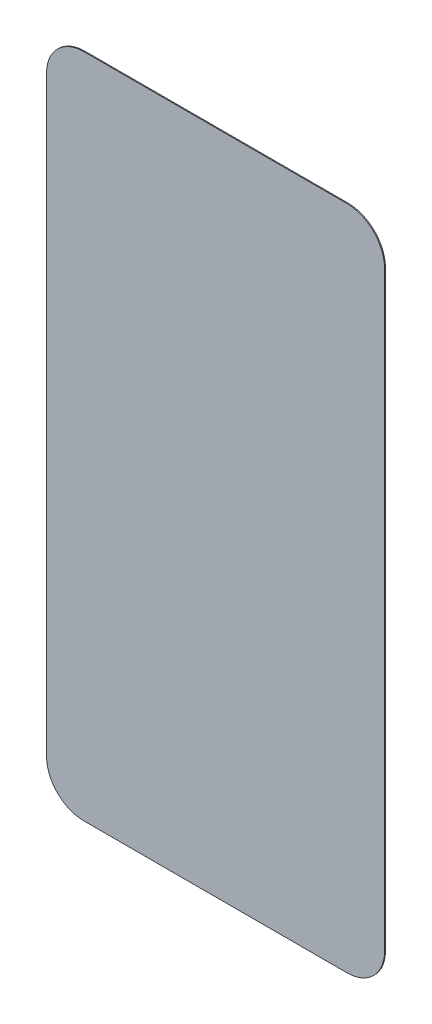
ISO-10303-21;
HEADER;
FILE_DESCRIPTION(('STEP AP214'),'2;1');
FILE_NAME('part.step','',(''),(''),'','','');
FILE_SCHEMA(('AUTOMOTIVE_DESIGN { 1 0 10303 214 1 1 1 1 }'));
ENDSEC;
DATA;
#1=APPLICATION_CONTEXT('core data for automotive mechanical design processes');
#2=APPLICATION_PROTOCOL_DEFINITION('international standard','automotive_design',2000,#1);
#3=PRODUCT_CONTEXT('',#1,'mechanical');
#4=PRODUCT('Part','Part','',(#3));
#5=PRODUCT_RELATED_PRODUCT_CATEGORY('part','',(#4));
#6=PRODUCT_DEFINITION_FORMATION('','',#4);
#7=PRODUCT_DEFINITION_CONTEXT('part definition',#1,'design');
#8=PRODUCT_DEFINITION('design','',#6,#7);
#9=PRODUCT_DEFINITION_SHAPE('','',#8);
#10=(LENGTH_UNIT() NAMED_UNIT(*) SI_UNIT(.MILLI.,.METRE.));
#11=(NAMED_UNIT(*) PLANE_ANGLE_UNIT() SI_UNIT($,.RADIAN.));
#12=(NAMED_UNIT(*) SI_UNIT($,.STERADIAN.) SOLID_ANGLE_UNIT());
#13=UNCERTAINTY_MEASURE_WITH_UNIT(LENGTH_MEASURE(1.E-05),#10,'distance_accuracy_value','');
#14=(GEOMETRIC_REPRESENTATION_CONTEXT(3) GLOBAL_UNCERTAINTY_ASSIGNED_CONTEXT((#13)) GLOBAL_UNIT_ASSIGNED_CONTEXT((#10,
#11,#12)) REPRESENTATION_CONTEXT('',''));
#15=CARTESIAN_POINT('',(0.,0.,0.));
#16=DIRECTION('',(0.,0.,1.));
#17=DIRECTION('',(1.,0.,0.));
#18=AXIS2_PLACEMENT_3D('',#15,#16,#17);
#19=CARTESIAN_POINT('',(15.0686807312206,1.18938950616404,0.5));
#20=DIRECTION('',(0.,0.,-1.));
#21=DIRECTION('',(-1.,0.,0.));
#22=AXIS2_PLACEMENT_3D('',#19,#20,#21);
#23=CYLINDRICAL_SURFACE('',#22,20.);
#24=CARTESIAN_POINT('',(15.0686807312206,1.18938950616404,0.));
#25=DIRECTION('',(0.,0.,1.));
#26=DIRECTION('',(1.,0.,0.));
#27=AXIS2_PLACEMENT_3D('',#24,#25,#26);
#28=CIRCLE('',#27,20.);
#29=CARTESIAN_POINT('',(15.0686807312208,21.189389506164,0.));
#30=VERTEX_POINT('',#29);
#31=CARTESIAN_POINT('',(-4.93131926877938,1.18938950616389,0.));
#32=VERTEX_POINT('',#31);
#33=EDGE_CURVE('E128',#30,#32,#28,.T.);
#34=ORIENTED_EDGE('',*,*,#33,.T.);
#35=DIRECTION('',(0.,0.,-1.));
#36=VECTOR('',#35,1.);
#37=CARTESIAN_POINT('',(-4.93131926877938,1.18938950616389,0.5));
#38=LINE('',#37,#36);
#39=CARTESIAN_POINT('',(-4.93131926877938,1.18938950616389,0.5));
#40=VERTEX_POINT('',#39);
#41=EDGE_CURVE('E11',#40,#32,#38,.T.);
#42=ORIENTED_EDGE('',*,*,#41,.F.);
#43=CARTESIAN_POINT('',(15.0686807312206,1.18938950616404,0.5));
#44=DIRECTION('',(0.,0.,1.));
#45=DIRECTION('',(1.,0.,0.));
#46=AXIS2_PLACEMENT_3D('',#43,#44,#45);
#47=CIRCLE('',#46,20.);
#48=CARTESIAN_POINT('',(15.0686807312208,21.189389506164,0.5));
#49=VERTEX_POINT('',#48);
#50=EDGE_CURVE('E142',#49,#40,#47,.T.);
#51=ORIENTED_EDGE('',*,*,#50,.F.);
#52=DIRECTION('',(0.,0.,-1.));
#53=VECTOR('',#52,1.);
#54=CARTESIAN_POINT('',(15.0686807312208,21.189389506164,0.5));
#55=LINE('',#54,#53);
#56=EDGE_CURVE('E124',#49,#30,#55,.T.);
#57=ORIENTED_EDGE('',*,*,#56,.T.);
#58=EDGE_LOOP('',(#34,#42,#51,#57));
#59=FACE_BOUND('',#58,.T.);
#60=ADVANCED_FACE('F32',(#59),#23,.T.);
#61=CARTESIAN_POINT('',(-4.93131926877938,1.18938950616389,0.5));
#62=DIRECTION('',(1.,0.,0.));
#63=DIRECTION('',(0.,0.,-1.));
#64=AXIS2_PLACEMENT_3D('',#61,#62,#63);
#65=PLANE('',#64);
#66=DIRECTION('',(0.,-1.,0.));
#67=VECTOR('',#66,1.);
#68=CARTESIAN_POINT('',(-4.93131926877938,1.18938950616389,0.));
#69=LINE('',#68,#67);
#70=CARTESIAN_POINT('',(-4.93131926877939,-315.57171294921,0.));
#71=VERTEX_POINT('',#70);
#72=EDGE_CURVE('E131',#32,#71,#69,.T.);
#73=ORIENTED_EDGE('',*,*,#72,.T.);
#74=DIRECTION('',(0.,0.,-1.));
#75=VECTOR('',#74,1.);
#76=CARTESIAN_POINT('',(-4.93131926877939,-315.57171294921,0.5));
#77=LINE('',#76,#75);
#78=CARTESIAN_POINT('',(-4.93131926877939,-315.57171294921,0.5));
#79=VERTEX_POINT('',#78);
#80=EDGE_CURVE('E40',#79,#71,#77,.T.);
#81=ORIENTED_EDGE('',*,*,#80,.F.);
#82=DIRECTION('',(0.,-1.,0.));
#83=VECTOR('',#82,1.);
#84=CARTESIAN_POINT('',(-4.93131926877938,1.18938950616389,0.5));
#85=LINE('',#84,#83);
#86=EDGE_CURVE('E91',#40,#79,#85,.T.);
#87=ORIENTED_EDGE('',*,*,#86,.F.);
#88=ORIENTED_EDGE('',*,*,#41,.T.);
#89=EDGE_LOOP('',(#73,#81,#87,#88));
#90=FACE_BOUND('',#89,.T.);
#91=ADVANCED_FACE('F177',(#90),#65,.F.);
#92=CARTESIAN_POINT('',(15.0686807312206,-315.57171294921,0.5));
#93=DIRECTION('',(0.,0.,-1.));
#94=DIRECTION('',(-1.,0.,0.));
#95=AXIS2_PLACEMENT_3D('',#92,#93,#94);
#96=CYLINDRICAL_SURFACE('',#95,20.);
#97=CARTESIAN_POINT('',(15.0686807312206,-315.57171294921,0.));
#98=DIRECTION('',(0.,0.,1.));
#99=DIRECTION('',(1.,0.,0.));
#100=AXIS2_PLACEMENT_3D('',#97,#98,#99);
#101=CIRCLE('',#100,20.);
#102=CARTESIAN_POINT('',(15.0686807312208,-335.57171294921,0.));
#103=VERTEX_POINT('',#102);
#104=EDGE_CURVE('E133',#71,#103,#101,.T.);
#105=ORIENTED_EDGE('',*,*,#104,.T.);
#106=DIRECTION('',(0.,0.,-1.));
#107=VECTOR('',#106,1.);
#108=CARTESIAN_POINT('',(15.0686807312208,-335.57171294921,0.5));
#109=LINE('',#108,#107);
#110=CARTESIAN_POINT('',(15.0686807312208,-335.57171294921,0.5));
#111=VERTEX_POINT('',#110);
#112=EDGE_CURVE('E149',#111,#103,#109,.T.);
#113=ORIENTED_EDGE('',*,*,#112,.F.);
#114=CARTESIAN_POINT('',(15.0686807312206,-315.57171294921,0.5));
#115=DIRECTION('',(0.,0.,1.));
#116=DIRECTION('',(1.,0.,0.));
#117=AXIS2_PLACEMENT_3D('',#114,#115,#116);
#118=CIRCLE('',#117,20.);
#119=EDGE_CURVE('E157',#79,#111,#118,.T.);
#120=ORIENTED_EDGE('',*,*,#119,.F.);
#121=ORIENTED_EDGE('',*,*,#80,.T.);
#122=EDGE_LOOP('',(#105,#113,#120,#121));
#123=FACE_BOUND('',#122,.T.);
#124=ADVANCED_FACE('F155',(#123),#96,.T.);
#125=CARTESIAN_POINT('',(15.0686807312208,-335.57171294921,0.5));
#126=DIRECTION('',(0.,1.,0.));
#127=DIRECTION('',(0.,0.,1.));
#128=AXIS2_PLACEMENT_3D('',#125,#126,#127);
#129=PLANE('',#128);
#130=DIRECTION('',(1.,0.,0.));
#131=VECTOR('',#130,1.);
#132=CARTESIAN_POINT('',(15.0686807312208,-335.57171294921,0.));
#133=LINE('',#132,#131);
#134=CARTESIAN_POINT('',(156.068680731221,-335.57171294921,0.));
#135=VERTEX_POINT('',#134);
#136=EDGE_CURVE('E135',#103,#135,#133,.T.);
#137=ORIENTED_EDGE('',*,*,#136,.T.);
#138=DIRECTION('',(0.,0.,-1.));
#139=VECTOR('',#138,1.);
#140=CARTESIAN_POINT('',(156.068680731221,-335.57171294921,0.5));
#141=LINE('',#140,#139);
#142=CARTESIAN_POINT('',(156.068680731221,-335.57171294921,0.5));
#143=VERTEX_POINT('',#142);
#144=EDGE_CURVE('E146',#143,#135,#141,.T.);
#145=ORIENTED_EDGE('',*,*,#144,.F.);
#146=DIRECTION('',(1.,0.,0.));
#147=VECTOR('',#146,1.);
#148=CARTESIAN_POINT('',(15.0686807312208,-335.57171294921,0.5));
#149=LINE('',#148,#147);
#150=EDGE_CURVE('E169',#111,#143,#149,.T.);
#151=ORIENTED_EDGE('',*,*,#150,.F.);
#152=ORIENTED_EDGE('',*,*,#112,.T.);
#153=EDGE_LOOP('',(#137,#145,#151,#152));
#154=FACE_BOUND('',#153,.T.);
#155=ADVANCED_FACE('F165',(#154),#129,.F.);
#156=CARTESIAN_POINT('',(156.068680731221,-315.57171294921,0.5));
#157=DIRECTION('',(0.,0.,-1.));
#158=DIRECTION('',(-1.,0.,0.));
#159=AXIS2_PLACEMENT_3D('',#156,#157,#158);
#160=CYLINDRICAL_SURFACE('',#159,20.);
#161=CARTESIAN_POINT('',(156.068680731221,-315.57171294921,0.));
#162=DIRECTION('',(0.,0.,1.));
#163=DIRECTION('',(1.,0.,0.));
#164=AXIS2_PLACEMENT_3D('',#161,#162,#163);
#165=CIRCLE('',#164,20.);
#166=CARTESIAN_POINT('',(176.068680731221,-315.57171294921,0.));
#167=VERTEX_POINT('',#166);
#168=EDGE_CURVE('E137',#135,#167,#165,.T.);
#169=ORIENTED_EDGE('',*,*,#168,.T.);
#170=DIRECTION('',(0.,0.,-1.));
#171=VECTOR('',#170,1.);
#172=CARTESIAN_POINT('',(176.068680731221,-315.57171294921,0.5));
#173=LINE('',#172,#171);
#174=CARTESIAN_POINT('',(176.068680731221,-315.57171294921,0.5));
#175=VERTEX_POINT('',#174);
#176=EDGE_CURVE('E119',#175,#167,#173,.T.);
#177=ORIENTED_EDGE('',*,*,#176,.F.);
#178=CARTESIAN_POINT('',(156.068680731221,-315.57171294921,0.5));
#179=DIRECTION('',(0.,0.,1.));
#180=DIRECTION('',(1.,0.,0.));
#181=AXIS2_PLACEMENT_3D('',#178,#179,#180);
#182=CIRCLE('',#181,20.);
#183=EDGE_CURVE('E110',#143,#175,#182,.T.);
#184=ORIENTED_EDGE('',*,*,#183,.F.);
#185=ORIENTED_EDGE('',*,*,#144,.T.);
#186=EDGE_LOOP('',(#169,#177,#184,#185));
#187=FACE_BOUND('',#186,.T.);
#188=ADVANCED_FACE('F168',(#187),#160,.T.);
#189=CARTESIAN_POINT('',(176.068680731221,1.18938950616404,0.5));
#190=DIRECTION('',(-1.,0.,0.));
#191=DIRECTION('',(0.,-1.,0.));
#192=AXIS2_PLACEMENT_3D('',#189,#190,#191);
#193=PLANE('',#192);
#194=DIRECTION('',(0.,1.,0.));
#195=VECTOR('',#194,1.);
#196=CARTESIAN_POINT('',(176.068680731221,1.18938950616404,0.));
#197=LINE('',#196,#195);
#198=CARTESIAN_POINT('',(176.068680731221,1.18938950616404,0.));
#199=VERTEX_POINT('',#198);
#200=EDGE_CURVE('E118',#167,#199,#197,.T.);
#201=ORIENTED_EDGE('',*,*,#200,.T.);
#202=DIRECTION('',(0.,0.,-1.));
#203=VECTOR('',#202,1.);
#204=CARTESIAN_POINT('',(176.068680731221,1.18938950616404,0.5));
#205=LINE('',#204,#203);
#206=CARTESIAN_POINT('',(176.068680731221,1.18938950616404,0.5));
#207=VERTEX_POINT('',#206);
#208=EDGE_CURVE('E115',#207,#199,#205,.T.);
#209=ORIENTED_EDGE('',*,*,#208,.F.);
#210=DIRECTION('',(0.,1.,0.));
#211=VECTOR('',#210,1.);
#212=CARTESIAN_POINT('',(176.068680731221,1.18938950616404,0.5));
#213=LINE('',#212,#211);
#214=EDGE_CURVE('E104',#175,#207,#213,.T.);
#215=ORIENTED_EDGE('',*,*,#214,.F.);
#216=ORIENTED_EDGE('',*,*,#176,.T.);
#217=EDGE_LOOP('',(#201,#209,#215,#216));
#218=FACE_BOUND('',#217,.T.);
#219=ADVANCED_FACE('F116',(#218),#193,.F.);
#220=CARTESIAN_POINT('',(156.068680731221,1.18938950616404,0.5));
#221=DIRECTION('',(0.,0.,-1.));
#222=DIRECTION('',(-1.,0.,0.));
#223=AXIS2_PLACEMENT_3D('',#220,#221,#222);
#224=CYLINDRICAL_SURFACE('',#223,20.);
#225=CARTESIAN_POINT('',(156.068680731221,1.18938950616404,0.));
#226=DIRECTION('',(0.,0.,1.));
#227=DIRECTION('',(1.,0.,0.));
#228=AXIS2_PLACEMENT_3D('',#225,#226,#227);
#229=CIRCLE('',#228,20.);
#230=CARTESIAN_POINT('',(156.068680731221,21.189389506164,0.));
#231=VERTEX_POINT('',#230);
#232=EDGE_CURVE('E77',#199,#231,#229,.T.);
#233=ORIENTED_EDGE('',*,*,#232,.T.);
#234=DIRECTION('',(0.,0.,-1.));
#235=VECTOR('',#234,1.);
#236=CARTESIAN_POINT('',(156.068680731221,21.189389506164,0.5));
#237=LINE('',#236,#235);
#238=CARTESIAN_POINT('',(156.068680731221,21.189389506164,0.5));
#239=VERTEX_POINT('',#238);
#240=EDGE_CURVE('E120',#239,#231,#237,.T.);
#241=ORIENTED_EDGE('',*,*,#240,.F.);
#242=CARTESIAN_POINT('',(156.068680731221,1.18938950616404,0.5));
#243=DIRECTION('',(0.,0.,1.));
#244=DIRECTION('',(1.,0.,0.));
#245=AXIS2_PLACEMENT_3D('',#242,#243,#244);
#246=CIRCLE('',#245,20.);
#247=EDGE_CURVE('E108',#207,#239,#246,.T.);
#248=ORIENTED_EDGE('',*,*,#247,.F.);
#249=ORIENTED_EDGE('',*,*,#208,.T.);
#250=EDGE_LOOP('',(#233,#241,#248,#249));
#251=FACE_BOUND('',#250,.T.);
#252=ADVANCED_FACE('F122',(#251),#224,.T.);
#253=CARTESIAN_POINT('',(15.0686807312208,21.189389506164,0.5));
#254=DIRECTION('',(0.,-1.,0.));
#255=DIRECTION('',(0.,0.,-1.));
#256=AXIS2_PLACEMENT_3D('',#253,#254,#255);
#257=PLANE('',#256);
#258=DIRECTION('',(-1.,0.,0.));
#259=VECTOR('',#258,1.);
#260=CARTESIAN_POINT('',(15.0686807312208,21.189389506164,0.));
#261=LINE('',#260,#259);
#262=EDGE_CURVE('E83',#231,#30,#261,.T.);
#263=ORIENTED_EDGE('',*,*,#262,.T.);
#264=ORIENTED_EDGE('',*,*,#56,.F.);
#265=DIRECTION('',(-1.,0.,0.));
#266=VECTOR('',#265,1.);
#267=CARTESIAN_POINT('',(15.0686807312208,21.189389506164,0.5));
#268=LINE('',#267,#266);
#269=EDGE_CURVE('E48',#239,#49,#268,.T.);
#270=ORIENTED_EDGE('',*,*,#269,.F.);
#271=ORIENTED_EDGE('',*,*,#240,.T.);
#272=EDGE_LOOP('',(#263,#264,#270,#271));
#273=FACE_BOUND('',#272,.T.);
#274=ADVANCED_FACE('F193',(#273),#257,.F.);
#275=CARTESIAN_POINT('',(15.0686807312206,1.18938950616404,0.5));
#276=DIRECTION('',(0.,0.,1.));
#277=DIRECTION('',(1.,0.,0.));
#278=AXIS2_PLACEMENT_3D('',#275,#276,#277);
#279=PLANE('',#278);
#280=ORIENTED_EDGE('',*,*,#50,.T.);
#281=ORIENTED_EDGE('',*,*,#86,.T.);
#282=ORIENTED_EDGE('',*,*,#119,.T.);
#283=ORIENTED_EDGE('',*,*,#150,.T.);
#284=ORIENTED_EDGE('',*,*,#183,.T.);
#285=ORIENTED_EDGE('',*,*,#214,.T.);
#286=ORIENTED_EDGE('',*,*,#247,.T.);
#287=ORIENTED_EDGE('',*,*,#269,.T.);
#288=EDGE_LOOP('',(#280,#281,#282,#283,#284,#285,#286,#287));
#289=FACE_BOUND('',#288,.T.);
#290=ADVANCED_FACE('F106',(#289),#279,.T.);
#291=CARTESIAN_POINT('',(15.0686807312206,1.18938950616404,0.));
#292=DIRECTION('',(0.,0.,1.));
#293=DIRECTION('',(1.,0.,0.));
#294=AXIS2_PLACEMENT_3D('',#291,#292,#293);
#295=PLANE('',#294);
#296=ORIENTED_EDGE('',*,*,#33,.F.);
#297=ORIENTED_EDGE('',*,*,#262,.F.);
#298=ORIENTED_EDGE('',*,*,#232,.F.);
#299=ORIENTED_EDGE('',*,*,#200,.F.);
#300=ORIENTED_EDGE('',*,*,#168,.F.);
#301=ORIENTED_EDGE('',*,*,#136,.F.);
#302=ORIENTED_EDGE('',*,*,#104,.F.);
#303=ORIENTED_EDGE('',*,*,#72,.F.);
#304=EDGE_LOOP('',(#296,#297,#298,#299,#300,#301,#302,#303));
#305=FACE_BOUND('',#304,.T.);
#306=ADVANCED_FACE('F161',(#305),#295,.F.);
#307=CLOSED_SHELL('',(#60,#91,#124,#155,#188,#219,#252,#274,#290,#306));
#308=MANIFOLD_SOLID_BREP('B2',#307);
#309=ADVANCED_BREP_SHAPE_REPRESENTATION('',(#18,#308),#14);
#310=SHAPE_DEFINITION_REPRESENTATION(#9,#309);
ENDSEC;
END-ISO-10303-21;
